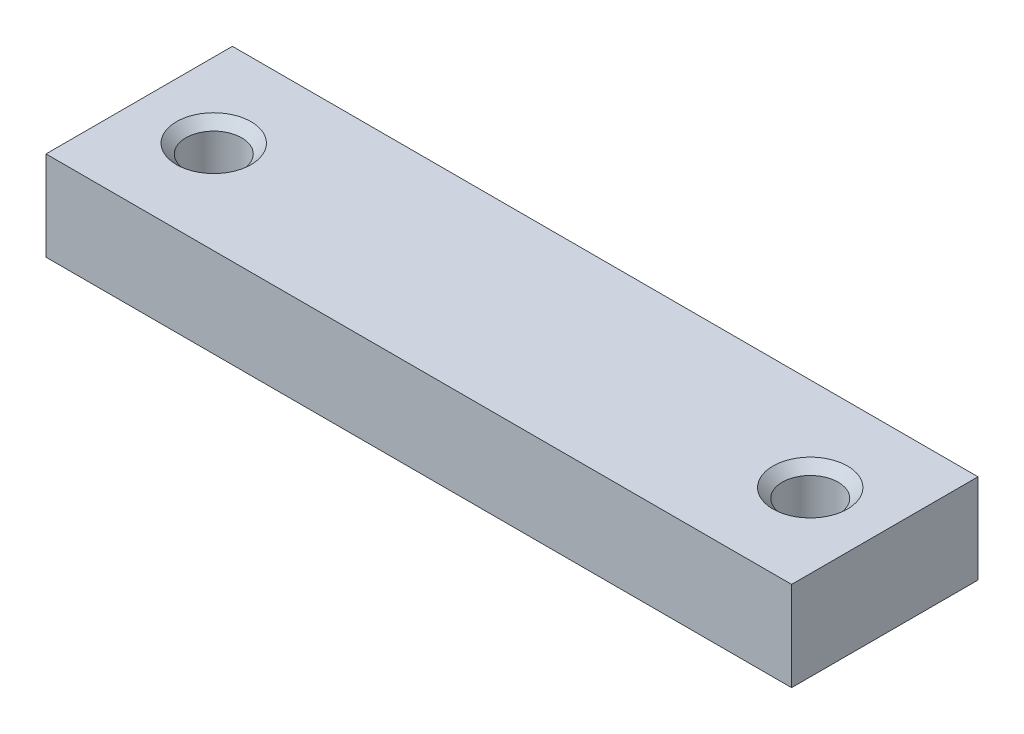
ISO-10303-21;
HEADER;
FILE_DESCRIPTION(('STEP AP214'),'2;1');
FILE_NAME('part.step','',(''),(''),'','','');
FILE_SCHEMA(('AUTOMOTIVE_DESIGN { 1 0 10303 214 1 1 1 1 }'));
ENDSEC;
DATA;
#1=APPLICATION_CONTEXT('core data for automotive mechanical design processes');
#2=APPLICATION_PROTOCOL_DEFINITION('international standard','automotive_design',2000,#1);
#3=PRODUCT_CONTEXT('',#1,'mechanical');
#4=PRODUCT('Part','Part','',(#3));
#5=PRODUCT_RELATED_PRODUCT_CATEGORY('part','',(#4));
#6=PRODUCT_DEFINITION_FORMATION('','',#4);
#7=PRODUCT_DEFINITION_CONTEXT('part definition',#1,'design');
#8=PRODUCT_DEFINITION('design','',#6,#7);
#9=PRODUCT_DEFINITION_SHAPE('','',#8);
#10=(LENGTH_UNIT() NAMED_UNIT(*) SI_UNIT(.MILLI.,.METRE.));
#11=(NAMED_UNIT(*) PLANE_ANGLE_UNIT() SI_UNIT($,.RADIAN.));
#12=(NAMED_UNIT(*) SI_UNIT($,.STERADIAN.) SOLID_ANGLE_UNIT());
#13=UNCERTAINTY_MEASURE_WITH_UNIT(LENGTH_MEASURE(1.E-05),#10,'distance_accuracy_value','');
#14=(GEOMETRIC_REPRESENTATION_CONTEXT(3) GLOBAL_UNCERTAINTY_ASSIGNED_CONTEXT((#13)) GLOBAL_UNIT_ASSIGNED_CONTEXT((#10,
#11,#12)) REPRESENTATION_CONTEXT('',''));
#15=CARTESIAN_POINT('',(0.,0.,0.));
#16=DIRECTION('',(0.,0.,1.));
#17=DIRECTION('',(1.,0.,0.));
#18=AXIS2_PLACEMENT_3D('',#15,#16,#17);
#19=CARTESIAN_POINT('',(50.,6.,-12.5));
#20=DIRECTION('',(-1.,0.,0.));
#21=DIRECTION('',(0.,0.,1.));
#22=AXIS2_PLACEMENT_3D('',#19,#20,#21);
#23=PLANE('',#22);
#24=DIRECTION('',(0.,0.,-1.));
#25=VECTOR('',#24,1.);
#26=CARTESIAN_POINT('',(50.,-6.,-12.5));
#27=LINE('',#26,#25);
#28=CARTESIAN_POINT('',(50.,-6.,12.5));
#29=VERTEX_POINT('',#28);
#30=CARTESIAN_POINT('',(50.,-6.,-12.5));
#31=VERTEX_POINT('',#30);
#32=EDGE_CURVE('E107',#29,#31,#27,.T.);
#33=ORIENTED_EDGE('',*,*,#32,.T.);
#34=DIRECTION('',(0.,-1.,0.));
#35=VECTOR('',#34,1.);
#36=CARTESIAN_POINT('',(50.,6.,-12.5));
#37=LINE('',#36,#35);
#38=CARTESIAN_POINT('',(50.,6.,-12.5));
#39=VERTEX_POINT('',#38);
#40=EDGE_CURVE('E98',#39,#31,#37,.T.);
#41=ORIENTED_EDGE('',*,*,#40,.F.);
#42=DIRECTION('',(0.,0.,-1.));
#43=VECTOR('',#42,1.);
#44=CARTESIAN_POINT('',(50.,6.,-12.5));
#45=LINE('',#44,#43);
#46=CARTESIAN_POINT('',(50.,6.,12.5));
#47=VERTEX_POINT('',#46);
#48=EDGE_CURVE('E92',#47,#39,#45,.T.);
#49=ORIENTED_EDGE('',*,*,#48,.F.);
#50=DIRECTION('',(0.,-1.,0.));
#51=VECTOR('',#50,1.);
#52=CARTESIAN_POINT('',(50.,6.,12.5));
#53=LINE('',#52,#51);
#54=EDGE_CURVE('E103',#47,#29,#53,.T.);
#55=ORIENTED_EDGE('',*,*,#54,.T.);
#56=EDGE_LOOP('',(#33,#41,#49,#55));
#57=FACE_BOUND('',#56,.T.);
#58=ADVANCED_FACE('F38',(#57),#23,.F.);
#59=CARTESIAN_POINT('',(-50.,6.,-12.5));
#60=DIRECTION('',(0.,0.,1.));
#61=DIRECTION('',(1.,0.,0.));
#62=AXIS2_PLACEMENT_3D('',#59,#60,#61);
#63=PLANE('',#62);
#64=DIRECTION('',(-1.,0.,0.));
#65=VECTOR('',#64,1.);
#66=CARTESIAN_POINT('',(-50.,-6.,-12.5));
#67=LINE('',#66,#65);
#68=CARTESIAN_POINT('',(-50.,-6.,-12.5));
#69=VERTEX_POINT('',#68);
#70=EDGE_CURVE('E97',#31,#69,#67,.T.);
#71=ORIENTED_EDGE('',*,*,#70,.T.);
#72=DIRECTION('',(0.,-1.,0.));
#73=VECTOR('',#72,1.);
#74=CARTESIAN_POINT('',(-50.,6.,-12.5));
#75=LINE('',#74,#73);
#76=CARTESIAN_POINT('',(-50.,6.,-12.5));
#77=VERTEX_POINT('',#76);
#78=EDGE_CURVE('E95',#77,#69,#75,.T.);
#79=ORIENTED_EDGE('',*,*,#78,.F.);
#80=DIRECTION('',(-1.,0.,0.));
#81=VECTOR('',#80,1.);
#82=CARTESIAN_POINT('',(-50.,6.,-12.5));
#83=LINE('',#82,#81);
#84=EDGE_CURVE('E87',#39,#77,#83,.T.);
#85=ORIENTED_EDGE('',*,*,#84,.F.);
#86=ORIENTED_EDGE('',*,*,#40,.T.);
#87=EDGE_LOOP('',(#71,#79,#85,#86));
#88=FACE_BOUND('',#87,.T.);
#89=ADVANCED_FACE('F96',(#88),#63,.F.);
#90=CARTESIAN_POINT('',(-50.,6.,-12.5));
#91=DIRECTION('',(1.,0.,0.));
#92=DIRECTION('',(0.,0.,-1.));
#93=AXIS2_PLACEMENT_3D('',#90,#91,#92);
#94=PLANE('',#93);
#95=DIRECTION('',(0.,0.,1.));
#96=VECTOR('',#95,1.);
#97=CARTESIAN_POINT('',(-50.,-6.,-12.5));
#98=LINE('',#97,#96);
#99=CARTESIAN_POINT('',(-50.,-6.,12.5));
#100=VERTEX_POINT('',#99);
#101=EDGE_CURVE('E73',#69,#100,#98,.T.);
#102=ORIENTED_EDGE('',*,*,#101,.T.);
#103=DIRECTION('',(0.,-1.,0.));
#104=VECTOR('',#103,1.);
#105=CARTESIAN_POINT('',(-50.,6.,12.5));
#106=LINE('',#105,#104);
#107=CARTESIAN_POINT('',(-50.,6.,12.5));
#108=VERTEX_POINT('',#107);
#109=EDGE_CURVE('E99',#108,#100,#106,.T.);
#110=ORIENTED_EDGE('',*,*,#109,.F.);
#111=DIRECTION('',(0.,0.,1.));
#112=VECTOR('',#111,1.);
#113=CARTESIAN_POINT('',(-50.,6.,-12.5));
#114=LINE('',#113,#112);
#115=EDGE_CURVE('E90',#77,#108,#114,.T.);
#116=ORIENTED_EDGE('',*,*,#115,.F.);
#117=ORIENTED_EDGE('',*,*,#78,.T.);
#118=EDGE_LOOP('',(#102,#110,#116,#117));
#119=FACE_BOUND('',#118,.T.);
#120=ADVANCED_FACE('F101',(#119),#94,.F.);
#121=CARTESIAN_POINT('',(-50.,6.,12.5));
#122=DIRECTION('',(0.,0.,-1.));
#123=DIRECTION('',(-1.,0.,0.));
#124=AXIS2_PLACEMENT_3D('',#121,#122,#123);
#125=PLANE('',#124);
#126=DIRECTION('',(1.,0.,0.));
#127=VECTOR('',#126,1.);
#128=CARTESIAN_POINT('',(-50.,-6.,12.5));
#129=LINE('',#128,#127);
#130=EDGE_CURVE('E79',#100,#29,#129,.T.);
#131=ORIENTED_EDGE('',*,*,#130,.T.);
#132=ORIENTED_EDGE('',*,*,#54,.F.);
#133=DIRECTION('',(1.,0.,0.));
#134=VECTOR('',#133,1.);
#135=CARTESIAN_POINT('',(-50.,6.,12.5));
#136=LINE('',#135,#134);
#137=EDGE_CURVE('E56',#108,#47,#136,.T.);
#138=ORIENTED_EDGE('',*,*,#137,.F.);
#139=ORIENTED_EDGE('',*,*,#109,.T.);
#140=EDGE_LOOP('',(#131,#132,#138,#139));
#141=FACE_BOUND('',#140,.T.);
#142=ADVANCED_FACE('F153',(#141),#125,.F.);
#143=CARTESIAN_POINT('',(0.,6.,0.));
#144=DIRECTION('',(0.,1.,0.));
#145=DIRECTION('',(0.,0.,1.));
#146=AXIS2_PLACEMENT_3D('',#143,#144,#145);
#147=PLANE('',#146);
#148=CARTESIAN_POINT('',(40.,6.,0.));
#149=DIRECTION('',(0.,1.,0.));
#150=DIRECTION('',(0.,0.,1.));
#151=AXIS2_PLACEMENT_3D('',#148,#149,#150);
#152=CIRCLE('',#151,5.00000000000002);
#153=CARTESIAN_POINT('',(40.,6.,5.00000000000001));
#154=VERTEX_POINT('',#153);
#155=EDGE_CURVE('E48',#154,#154,#152,.F.);
#156=ORIENTED_EDGE('',*,*,#155,.T.);
#157=EDGE_LOOP('',(#156));
#158=FACE_BOUND('',#157,.T.);
#159=CARTESIAN_POINT('',(-40.,6.,0.));
#160=DIRECTION('',(0.,1.,0.));
#161=DIRECTION('',(0.,0.,1.));
#162=AXIS2_PLACEMENT_3D('',#159,#160,#161);
#163=CIRCLE('',#162,5.00000000000003);
#164=CARTESIAN_POINT('',(-40.,6.,5.00000000000003));
#165=VERTEX_POINT('',#164);
#166=EDGE_CURVE('E120',#165,#165,#163,.F.);
#167=ORIENTED_EDGE('',*,*,#166,.T.);
#168=EDGE_LOOP('',(#167));
#169=FACE_BOUND('',#168,.T.);
#170=ORIENTED_EDGE('',*,*,#48,.T.);
#171=ORIENTED_EDGE('',*,*,#84,.T.);
#172=ORIENTED_EDGE('',*,*,#115,.T.);
#173=ORIENTED_EDGE('',*,*,#137,.T.);
#174=EDGE_LOOP('',(#170,#171,#172,#173));
#175=FACE_BOUND('',#174,.T.);
#176=ADVANCED_FACE('F88',(#158,#169,#175),#147,.T.);
#177=CARTESIAN_POINT('',(0.,-6.,0.));
#178=DIRECTION('',(0.,1.,0.));
#179=DIRECTION('',(0.,0.,1.));
#180=AXIS2_PLACEMENT_3D('',#177,#178,#179);
#181=PLANE('',#180);
#182=CARTESIAN_POINT('',(-40.,-6.,0.));
#183=DIRECTION('',(0.,1.,0.));
#184=DIRECTION('',(0.,0.,1.));
#185=AXIS2_PLACEMENT_3D('',#182,#183,#184);
#186=CIRCLE('',#185,3.75);
#187=CARTESIAN_POINT('',(-40.,-6.,3.75));
#188=VERTEX_POINT('',#187);
#189=EDGE_CURVE('E110',#188,#188,#186,.F.);
#190=ORIENTED_EDGE('',*,*,#189,.F.);
#191=EDGE_LOOP('',(#190));
#192=FACE_BOUND('',#191,.T.);
#193=CARTESIAN_POINT('',(40.,-6.,0.));
#194=DIRECTION('',(0.,1.,0.));
#195=DIRECTION('',(0.,0.,1.));
#196=AXIS2_PLACEMENT_3D('',#193,#194,#195);
#197=CIRCLE('',#196,3.75);
#198=CARTESIAN_POINT('',(40.,-6.,3.74999999999999));
#199=VERTEX_POINT('',#198);
#200=EDGE_CURVE('E140',#199,#199,#197,.F.);
#201=ORIENTED_EDGE('',*,*,#200,.F.);
#202=EDGE_LOOP('',(#201));
#203=FACE_BOUND('',#202,.T.);
#204=ORIENTED_EDGE('',*,*,#32,.F.);
#205=ORIENTED_EDGE('',*,*,#130,.F.);
#206=ORIENTED_EDGE('',*,*,#101,.F.);
#207=ORIENTED_EDGE('',*,*,#70,.F.);
#208=EDGE_LOOP('',(#204,#205,#206,#207));
#209=FACE_BOUND('',#208,.T.);
#210=ADVANCED_FACE('F136',(#192,#203,#209),#181,.F.);
#211=CARTESIAN_POINT('',(40.,-6.001,0.));
#212=DIRECTION('',(0.,1.,0.));
#213=DIRECTION('',(0.,0.,1.));
#214=AXIS2_PLACEMENT_3D('',#211,#212,#213);
#215=CYLINDRICAL_SURFACE('',#214,3.75);
#216=CARTESIAN_POINT('',(40.,4.75,0.));
#217=DIRECTION('',(0.,1.,0.));
#218=DIRECTION('',(0.,0.,1.));
#219=AXIS2_PLACEMENT_3D('',#216,#217,#218);
#220=CIRCLE('',#219,3.75);
#221=CARTESIAN_POINT('',(40.,4.75,3.74999999999999));
#222=VERTEX_POINT('',#221);
#223=EDGE_CURVE('E117',#222,#222,#220,.T.);
#224=ORIENTED_EDGE('',*,*,#223,.T.);
#225=EDGE_LOOP('',(#224));
#226=FACE_BOUND('',#225,.T.);
#227=ORIENTED_EDGE('',*,*,#200,.T.);
#228=EDGE_LOOP('',(#227));
#229=FACE_BOUND('',#228,.T.);
#230=ADVANCED_FACE('F133',(#226,#229),#215,.F.);
#231=CARTESIAN_POINT('',(-40.,-6.001,0.));
#232=DIRECTION('',(0.,1.,0.));
#233=DIRECTION('',(0.,0.,1.));
#234=AXIS2_PLACEMENT_3D('',#231,#232,#233);
#235=CYLINDRICAL_SURFACE('',#234,3.75);
#236=CARTESIAN_POINT('',(-40.,4.74999999999997,0.));
#237=DIRECTION('',(0.,1.,0.));
#238=DIRECTION('',(0.,0.,1.));
#239=AXIS2_PLACEMENT_3D('',#236,#237,#238);
#240=CIRCLE('',#239,3.75);
#241=CARTESIAN_POINT('',(-40.,4.74999999999997,3.75));
#242=VERTEX_POINT('',#241);
#243=EDGE_CURVE('E11',#242,#242,#240,.T.);
#244=ORIENTED_EDGE('',*,*,#243,.T.);
#245=EDGE_LOOP('',(#244));
#246=FACE_BOUND('',#245,.T.);
#247=ORIENTED_EDGE('',*,*,#189,.T.);
#248=EDGE_LOOP('',(#247));
#249=FACE_BOUND('',#248,.T.);
#250=ADVANCED_FACE('F130',(#246,#249),#235,.F.);
#251=CARTESIAN_POINT('',(40.,4.75,0.));
#252=DIRECTION('',(0.,1.,0.));
#253=DIRECTION('',(0.,0.,1.));
#254=AXIS2_PLACEMENT_3D('',#251,#252,#253);
#255=CONICAL_SURFACE('',#254,3.75,0.785398163397454);
#256=ORIENTED_EDGE('',*,*,#155,.F.);
#257=EDGE_LOOP('',(#256));
#258=FACE_BOUND('',#257,.T.);
#259=ORIENTED_EDGE('',*,*,#223,.F.);
#260=EDGE_LOOP('',(#259));
#261=FACE_BOUND('',#260,.T.);
#262=ADVANCED_FACE('F127',(#258,#261),#255,.F.);
#263=CARTESIAN_POINT('',(-40.,4.74999999999997,0.));
#264=DIRECTION('',(0.,1.,0.));
#265=DIRECTION('',(0.,0.,1.));
#266=AXIS2_PLACEMENT_3D('',#263,#264,#265);
#267=CONICAL_SURFACE('',#266,3.75,0.785398163397449);
#268=ORIENTED_EDGE('',*,*,#166,.F.);
#269=EDGE_LOOP('',(#268));
#270=FACE_BOUND('',#269,.T.);
#271=ORIENTED_EDGE('',*,*,#243,.F.);
#272=EDGE_LOOP('',(#271));
#273=FACE_BOUND('',#272,.T.);
#274=ADVANCED_FACE('F41',(#270,#273),#267,.F.);
#275=CLOSED_SHELL('',(#58,#89,#120,#142,#176,#210,#230,#250,#262,#274));
#276=MANIFOLD_SOLID_BREP('B2',#275);
#277=ADVANCED_BREP_SHAPE_REPRESENTATION('',(#18,#276),#14);
#278=SHAPE_DEFINITION_REPRESENTATION(#9,#277);
ENDSEC;
END-ISO-10303-21;
